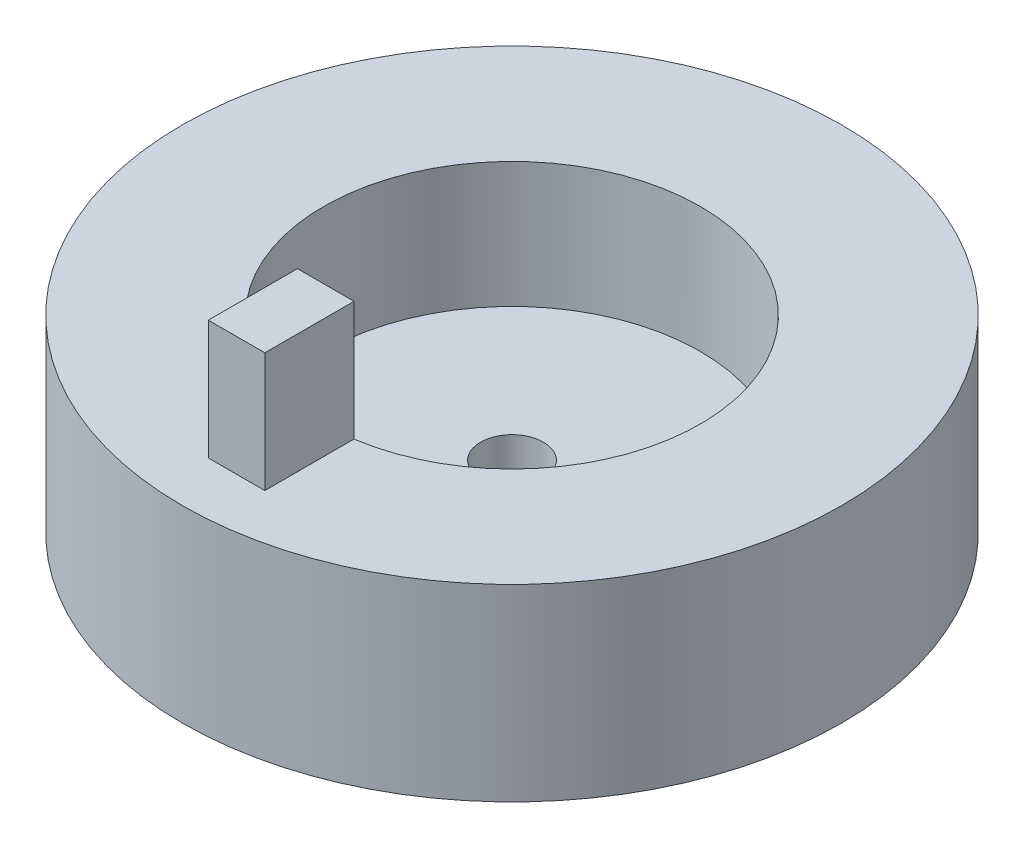
ISO-10303-21;
HEADER;
FILE_DESCRIPTION(('STEP AP214'),'2;1');
FILE_NAME('part.step','',(''),(''),'','','');
FILE_SCHEMA(('AUTOMOTIVE_DESIGN { 1 0 10303 214 1 1 1 1 }'));
ENDSEC;
DATA;
#1=APPLICATION_CONTEXT('core data for automotive mechanical design processes');
#2=APPLICATION_PROTOCOL_DEFINITION('international standard','automotive_design',2000,#1);
#3=PRODUCT_CONTEXT('',#1,'mechanical');
#4=PRODUCT('Part','Part','',(#3));
#5=PRODUCT_RELATED_PRODUCT_CATEGORY('part','',(#4));
#6=PRODUCT_DEFINITION_FORMATION('','',#4);
#7=PRODUCT_DEFINITION_CONTEXT('part definition',#1,'design');
#8=PRODUCT_DEFINITION('design','',#6,#7);
#9=PRODUCT_DEFINITION_SHAPE('','',#8);
#10=(LENGTH_UNIT() NAMED_UNIT(*) SI_UNIT(.MILLI.,.METRE.));
#11=(NAMED_UNIT(*) PLANE_ANGLE_UNIT() SI_UNIT($,.RADIAN.));
#12=(NAMED_UNIT(*) SI_UNIT($,.STERADIAN.) SOLID_ANGLE_UNIT());
#13=UNCERTAINTY_MEASURE_WITH_UNIT(LENGTH_MEASURE(1.E-05),#10,'distance_accuracy_value','');
#14=(GEOMETRIC_REPRESENTATION_CONTEXT(3) GLOBAL_UNCERTAINTY_ASSIGNED_CONTEXT((#13)) GLOBAL_UNIT_ASSIGNED_CONTEXT((#10,
#11,#12)) REPRESENTATION_CONTEXT('',''));
#15=CARTESIAN_POINT('',(0.,0.,0.));
#16=DIRECTION('',(0.,0.,1.));
#17=DIRECTION('',(1.,0.,0.));
#18=AXIS2_PLACEMENT_3D('',#15,#16,#17);
#19=CARTESIAN_POINT('',(0.,20.,0.));
#20=DIRECTION('',(0.,1.,0.));
#21=DIRECTION('',(0.,0.,1.));
#22=AXIS2_PLACEMENT_3D('',#19,#20,#21);
#23=PLANE('',#22);
#24=DIRECTION('',(0.,0.,1.));
#25=VECTOR('',#24,1.);
#26=CARTESIAN_POINT('',(-4.5,20.,29.6605798999278));
#27=LINE('',#26,#25);
#28=CARTESIAN_POINT('',(-4.50000000000001,20.,29.6605798999278));
#29=VERTEX_POINT('',#28);
#30=CARTESIAN_POINT('',(-4.49999999999999,20.,43.8605798999278));
#31=VERTEX_POINT('',#30);
#32=EDGE_CURVE('E61',#29,#31,#27,.T.);
#33=ORIENTED_EDGE('',*,*,#32,.F.);
#34=CARTESIAN_POINT('',(0.,20.,0.));
#35=DIRECTION('',(0.,1.,0.));
#36=DIRECTION('',(0.,0.,1.));
#37=AXIS2_PLACEMENT_3D('',#34,#35,#36);
#38=CIRCLE('',#37,30.);
#39=CARTESIAN_POINT('',(4.5,20.,29.6605798999278));
#40=VERTEX_POINT('',#39);
#41=EDGE_CURVE('E49',#40,#29,#38,.T.);
#42=ORIENTED_EDGE('',*,*,#41,.F.);
#43=DIRECTION('',(0.,0.,-1.));
#44=VECTOR('',#43,1.);
#45=CARTESIAN_POINT('',(4.5,20.,29.6605798999278));
#46=LINE('',#45,#44);
#47=CARTESIAN_POINT('',(4.5,20.,43.8605798999278));
#48=VERTEX_POINT('',#47);
#49=EDGE_CURVE('E138',#48,#40,#46,.T.);
#50=ORIENTED_EDGE('',*,*,#49,.F.);
#51=DIRECTION('',(1.,0.,0.));
#52=VECTOR('',#51,1.);
#53=CARTESIAN_POINT('',(-4.49999999999999,20.,43.8605798999278));
#54=LINE('',#53,#52);
#55=EDGE_CURVE('E56',#31,#48,#54,.T.);
#56=ORIENTED_EDGE('',*,*,#55,.F.);
#57=EDGE_LOOP('',(#33,#42,#50,#56));
#58=FACE_BOUND('',#57,.T.);
#59=CARTESIAN_POINT('',(0.,20.,0.));
#60=DIRECTION('',(0.,1.,0.));
#61=DIRECTION('',(0.,0.,1.));
#62=AXIS2_PLACEMENT_3D('',#59,#60,#61);
#63=CIRCLE('',#62,52.5);
#64=CARTESIAN_POINT('',(0.,20.,52.5));
#65=VERTEX_POINT('',#64);
#66=EDGE_CURVE('E11',#65,#65,#63,.T.);
#67=ORIENTED_EDGE('',*,*,#66,.T.);
#68=EDGE_LOOP('',(#67));
#69=FACE_BOUND('',#68,.T.);
#70=ADVANCED_FACE('F40',(#58,#69),#23,.T.);
#71=CARTESIAN_POINT('',(0.,20.,0.));
#72=DIRECTION('',(0.,-1.,0.));
#73=DIRECTION('',(0.,0.,-1.));
#74=AXIS2_PLACEMENT_3D('',#71,#72,#73);
#75=CYLINDRICAL_SURFACE('',#74,52.5);
#76=ORIENTED_EDGE('',*,*,#66,.F.);
#77=EDGE_LOOP('',(#76));
#78=FACE_BOUND('',#77,.T.);
#79=CARTESIAN_POINT('',(0.,-10.,0.));
#80=DIRECTION('',(0.,-1.,0.));
#81=DIRECTION('',(0.,0.,-1.));
#82=AXIS2_PLACEMENT_3D('',#79,#80,#81);
#83=CIRCLE('',#82,52.5);
#84=CARTESIAN_POINT('',(0.,-10.,-52.5));
#85=VERTEX_POINT('',#84);
#86=EDGE_CURVE('E117',#85,#85,#83,.T.);
#87=ORIENTED_EDGE('',*,*,#86,.F.);
#88=EDGE_LOOP('',(#87));
#89=FACE_BOUND('',#88,.T.);
#90=ADVANCED_FACE('F42',(#78,#89),#75,.T.);
#91=CARTESIAN_POINT('',(0.,20.,0.));
#92=DIRECTION('',(0.,-1.,0.));
#93=DIRECTION('',(0.,0.,-1.));
#94=AXIS2_PLACEMENT_3D('',#91,#92,#93);
#95=CYLINDRICAL_SURFACE('',#94,30.);
#96=ORIENTED_EDGE('',*,*,#41,.T.);
#97=EDGE_CURVE('E123',#29,#40,#38,.T.);
#98=ORIENTED_EDGE('',*,*,#97,.T.);
#99=EDGE_LOOP('',(#96,#98));
#100=FACE_BOUND('',#99,.T.);
#101=CARTESIAN_POINT('',(0.,0.,0.));
#102=DIRECTION('',(0.,1.,0.));
#103=DIRECTION('',(0.,0.,1.));
#104=AXIS2_PLACEMENT_3D('',#101,#102,#103);
#105=CIRCLE('',#104,30.);
#106=CARTESIAN_POINT('',(0.,0.,30.));
#107=VERTEX_POINT('',#106);
#108=EDGE_CURVE('E121',#107,#107,#105,.T.);
#109=ORIENTED_EDGE('',*,*,#108,.F.);
#110=EDGE_LOOP('',(#109));
#111=FACE_BOUND('',#110,.T.);
#112=ADVANCED_FACE('F131',(#100,#111),#95,.F.);
#113=CARTESIAN_POINT('',(0.,0.,0.));
#114=DIRECTION('',(0.,-1.,0.));
#115=DIRECTION('',(0.,0.,-1.));
#116=AXIS2_PLACEMENT_3D('',#113,#114,#115);
#117=PLANE('',#116);
#118=CARTESIAN_POINT('',(0.,0.,0.));
#119=DIRECTION('',(0.,-1.,0.));
#120=DIRECTION('',(0.,0.,-1.));
#121=AXIS2_PLACEMENT_3D('',#118,#119,#120);
#122=CIRCLE('',#121,5.);
#123=CARTESIAN_POINT('',(0.,0.,-5.));
#124=VERTEX_POINT('',#123);
#125=EDGE_CURVE('E105',#124,#124,#122,.T.);
#126=ORIENTED_EDGE('',*,*,#125,.T.);
#127=EDGE_LOOP('',(#126));
#128=FACE_BOUND('',#127,.T.);
#129=ORIENTED_EDGE('',*,*,#108,.T.);
#130=EDGE_LOOP('',(#129));
#131=FACE_BOUND('',#130,.T.);
#132=ADVANCED_FACE('F178',(#128,#131),#117,.F.);
#133=CARTESIAN_POINT('',(0.,-10.,0.));
#134=DIRECTION('',(0.,-1.,0.));
#135=DIRECTION('',(0.,0.,-1.));
#136=AXIS2_PLACEMENT_3D('',#133,#134,#135);
#137=PLANE('',#136);
#138=ORIENTED_EDGE('',*,*,#86,.T.);
#139=EDGE_LOOP('',(#138));
#140=FACE_BOUND('',#139,.T.);
#141=CARTESIAN_POINT('',(0.,-10.,0.));
#142=DIRECTION('',(0.,-1.,0.));
#143=DIRECTION('',(0.,0.,-1.));
#144=AXIS2_PLACEMENT_3D('',#141,#142,#143);
#145=CIRCLE('',#144,5.);
#146=CARTESIAN_POINT('',(0.,-10.,-5.));
#147=VERTEX_POINT('',#146);
#148=EDGE_CURVE('E109',#147,#147,#145,.T.);
#149=ORIENTED_EDGE('',*,*,#148,.F.);
#150=EDGE_LOOP('',(#149));
#151=FACE_BOUND('',#150,.T.);
#152=ADVANCED_FACE('F173',(#140,#151),#137,.T.);
#153=CARTESIAN_POINT('',(0.,-10.,0.));
#154=DIRECTION('',(0.,1.,0.));
#155=DIRECTION('',(0.,0.,1.));
#156=AXIS2_PLACEMENT_3D('',#153,#154,#155);
#157=CYLINDRICAL_SURFACE('',#156,5.);
#158=ORIENTED_EDGE('',*,*,#148,.T.);
#159=EDGE_LOOP('',(#158));
#160=FACE_BOUND('',#159,.T.);
#161=ORIENTED_EDGE('',*,*,#125,.F.);
#162=EDGE_LOOP('',(#161));
#163=FACE_BOUND('',#162,.T.);
#164=ADVANCED_FACE('F177',(#160,#163),#157,.F.);
#165=CARTESIAN_POINT('',(-4.5,39.,29.6605798999278));
#166=DIRECTION('',(1.,0.,0.));
#167=DIRECTION('',(0.,0.,-1.));
#168=AXIS2_PLACEMENT_3D('',#165,#166,#167);
#169=PLANE('',#168);
#170=ORIENTED_EDGE('',*,*,#32,.T.);
#171=DIRECTION('',(0.,-1.,0.));
#172=VECTOR('',#171,1.);
#173=CARTESIAN_POINT('',(-4.49999999999999,39.,43.8605798999278));
#174=LINE('',#173,#172);
#175=CARTESIAN_POINT('',(-4.49999999999999,39.,43.8605798999278));
#176=VERTEX_POINT('',#175);
#177=EDGE_CURVE('E85',#176,#31,#174,.T.);
#178=ORIENTED_EDGE('',*,*,#177,.F.);
#179=DIRECTION('',(0.,0.,1.));
#180=VECTOR('',#179,1.);
#181=CARTESIAN_POINT('',(-4.5,39.,29.6605798999278));
#182=LINE('',#181,#180);
#183=CARTESIAN_POINT('',(-4.5,39.,29.6605798999278));
#184=VERTEX_POINT('',#183);
#185=EDGE_CURVE('E92',#184,#176,#182,.T.);
#186=ORIENTED_EDGE('',*,*,#185,.F.);
#187=DIRECTION('',(0.,-1.,0.));
#188=VECTOR('',#187,1.);
#189=CARTESIAN_POINT('',(-4.5,39.,29.6605798999278));
#190=LINE('',#189,#188);
#191=EDGE_CURVE('E146',#184,#29,#190,.T.);
#192=ORIENTED_EDGE('',*,*,#191,.T.);
#193=EDGE_LOOP('',(#170,#178,#186,#192));
#194=FACE_BOUND('',#193,.T.);
#195=ADVANCED_FACE('F104',(#194),#169,.F.);
#196=CARTESIAN_POINT('',(-4.49999999999999,39.,43.8605798999278));
#197=DIRECTION('',(0.,0.,-1.));
#198=DIRECTION('',(-1.,0.,0.));
#199=AXIS2_PLACEMENT_3D('',#196,#197,#198);
#200=PLANE('',#199);
#201=ORIENTED_EDGE('',*,*,#55,.T.);
#202=DIRECTION('',(0.,-1.,0.));
#203=VECTOR('',#202,1.);
#204=CARTESIAN_POINT('',(4.5,39.,43.8605798999278));
#205=LINE('',#204,#203);
#206=CARTESIAN_POINT('',(4.5,39.,43.8605798999278));
#207=VERTEX_POINT('',#206);
#208=EDGE_CURVE('E87',#207,#48,#205,.T.);
#209=ORIENTED_EDGE('',*,*,#208,.F.);
#210=DIRECTION('',(1.,0.,0.));
#211=VECTOR('',#210,1.);
#212=CARTESIAN_POINT('',(-4.49999999999999,39.,43.8605798999278));
#213=LINE('',#212,#211);
#214=EDGE_CURVE('E81',#176,#207,#213,.T.);
#215=ORIENTED_EDGE('',*,*,#214,.F.);
#216=ORIENTED_EDGE('',*,*,#177,.T.);
#217=EDGE_LOOP('',(#201,#209,#215,#216));
#218=FACE_BOUND('',#217,.T.);
#219=ADVANCED_FACE('F83',(#218),#200,.F.);
#220=CARTESIAN_POINT('',(4.5,39.,29.6605798999278));
#221=DIRECTION('',(-1.,0.,0.));
#222=DIRECTION('',(0.,0.,1.));
#223=AXIS2_PLACEMENT_3D('',#220,#221,#222);
#224=PLANE('',#223);
#225=ORIENTED_EDGE('',*,*,#49,.T.);
#226=DIRECTION('',(0.,-1.,0.));
#227=VECTOR('',#226,1.);
#228=CARTESIAN_POINT('',(4.5,39.,29.6605798999278));
#229=LINE('',#228,#227);
#230=CARTESIAN_POINT('',(4.5,39.,29.6605798999278));
#231=VERTEX_POINT('',#230);
#232=EDGE_CURVE('E111',#231,#40,#229,.T.);
#233=ORIENTED_EDGE('',*,*,#232,.F.);
#234=DIRECTION('',(0.,0.,-1.));
#235=VECTOR('',#234,1.);
#236=CARTESIAN_POINT('',(4.5,39.,29.6605798999278));
#237=LINE('',#236,#235);
#238=EDGE_CURVE('E91',#207,#231,#237,.T.);
#239=ORIENTED_EDGE('',*,*,#238,.F.);
#240=ORIENTED_EDGE('',*,*,#208,.T.);
#241=EDGE_LOOP('',(#225,#233,#239,#240));
#242=FACE_BOUND('',#241,.T.);
#243=ADVANCED_FACE('F142',(#242),#224,.F.);
#244=CARTESIAN_POINT('',(4.5,39.,29.6605798999278));
#245=DIRECTION('',(0.,0.,1.));
#246=DIRECTION('',(1.,0.,0.));
#247=AXIS2_PLACEMENT_3D('',#244,#245,#246);
#248=PLANE('',#247);
#249=DIRECTION('',(-1.,0.,0.));
#250=VECTOR('',#249,1.);
#251=CARTESIAN_POINT('',(4.5,20.,29.6605798999278));
#252=LINE('',#251,#250);
#253=EDGE_CURVE('E102',#40,#29,#252,.T.);
#254=ORIENTED_EDGE('',*,*,#253,.T.);
#255=ORIENTED_EDGE('',*,*,#191,.F.);
#256=DIRECTION('',(-1.,0.,0.));
#257=VECTOR('',#256,1.);
#258=CARTESIAN_POINT('',(4.5,39.,29.6605798999278));
#259=LINE('',#258,#257);
#260=EDGE_CURVE('E97',#231,#184,#259,.T.);
#261=ORIENTED_EDGE('',*,*,#260,.F.);
#262=ORIENTED_EDGE('',*,*,#232,.T.);
#263=EDGE_LOOP('',(#254,#255,#261,#262));
#264=FACE_BOUND('',#263,.T.);
#265=ADVANCED_FACE('F145',(#264),#248,.F.);
#266=CARTESIAN_POINT('',(0.,39.,0.));
#267=DIRECTION('',(0.,1.,0.));
#268=DIRECTION('',(0.,0.,1.));
#269=AXIS2_PLACEMENT_3D('',#266,#267,#268);
#270=PLANE('',#269);
#271=ORIENTED_EDGE('',*,*,#185,.T.);
#272=ORIENTED_EDGE('',*,*,#214,.T.);
#273=ORIENTED_EDGE('',*,*,#238,.T.);
#274=ORIENTED_EDGE('',*,*,#260,.T.);
#275=EDGE_LOOP('',(#271,#272,#273,#274));
#276=FACE_BOUND('',#275,.T.);
#277=ADVANCED_FACE('F95',(#276),#270,.T.);
#278=CARTESIAN_POINT('',(0.,20.,0.));
#279=DIRECTION('',(0.,1.,0.));
#280=DIRECTION('',(0.,0.,1.));
#281=AXIS2_PLACEMENT_3D('',#278,#279,#280);
#282=PLANE('',#281);
#283=ORIENTED_EDGE('',*,*,#97,.F.);
#284=ORIENTED_EDGE('',*,*,#253,.F.);
#285=EDGE_LOOP('',(#283,#284));
#286=FACE_BOUND('',#285,.T.);
#287=ADVANCED_FACE('F147',(#286),#282,.F.);
#288=CLOSED_SHELL('',(#70,#90,#112,#132,#152,#164,#195,#219,#243,#265,#277,#287));
#289=MANIFOLD_SOLID_BREP('B2',#288);
#290=ADVANCED_BREP_SHAPE_REPRESENTATION('',(#18,#289),#14);
#291=SHAPE_DEFINITION_REPRESENTATION(#9,#290);
ENDSEC;
END-ISO-10303-21;
